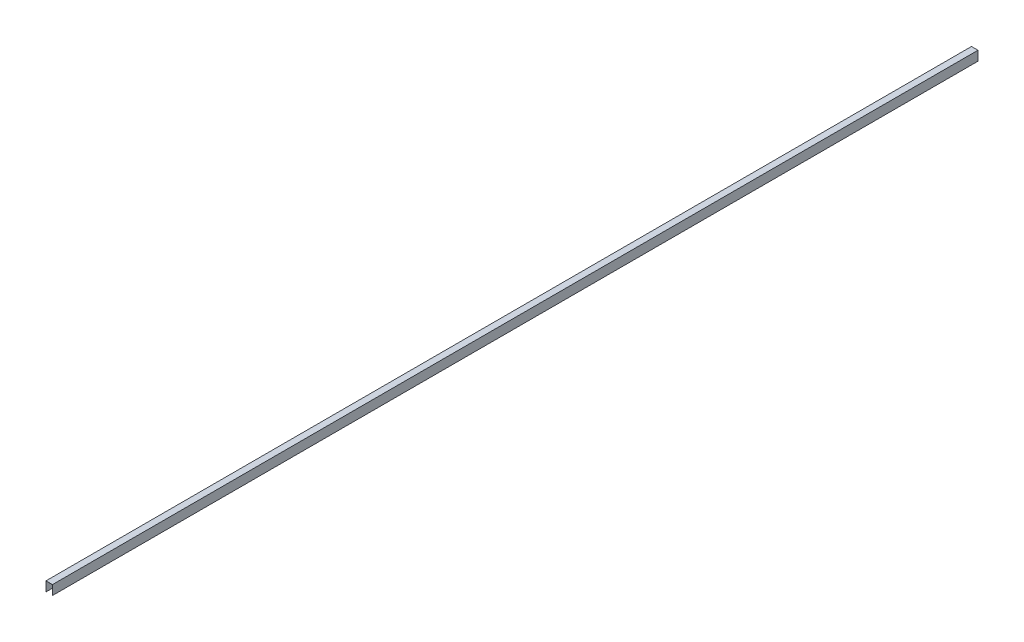
ISO-10303-21;
HEADER;
FILE_DESCRIPTION(('STEP AP214'),'2;1');
FILE_NAME('part.step','',(''),(''),'','','');
FILE_SCHEMA(('AUTOMOTIVE_DESIGN { 1 0 10303 214 1 1 1 1 }'));
ENDSEC;
DATA;
#1=APPLICATION_CONTEXT('core data for automotive mechanical design processes');
#2=APPLICATION_PROTOCOL_DEFINITION('international standard','automotive_design',2000,#1);
#3=PRODUCT_CONTEXT('',#1,'mechanical');
#4=PRODUCT('Part','Part','',(#3));
#5=PRODUCT_RELATED_PRODUCT_CATEGORY('part','',(#4));
#6=PRODUCT_DEFINITION_FORMATION('','',#4);
#7=PRODUCT_DEFINITION_CONTEXT('part definition',#1,'design');
#8=PRODUCT_DEFINITION('design','',#6,#7);
#9=PRODUCT_DEFINITION_SHAPE('','',#8);
#10=(LENGTH_UNIT() NAMED_UNIT(*) SI_UNIT(.MILLI.,.METRE.));
#11=(NAMED_UNIT(*) PLANE_ANGLE_UNIT() SI_UNIT($,.RADIAN.));
#12=(NAMED_UNIT(*) SI_UNIT($,.STERADIAN.) SOLID_ANGLE_UNIT());
#13=UNCERTAINTY_MEASURE_WITH_UNIT(LENGTH_MEASURE(1.E-05),#10,'distance_accuracy_value','');
#14=(GEOMETRIC_REPRESENTATION_CONTEXT(3) GLOBAL_UNCERTAINTY_ASSIGNED_CONTEXT((#13)) GLOBAL_UNIT_ASSIGNED_CONTEXT((#10,
#11,#12)) REPRESENTATION_CONTEXT('',''));
#15=CARTESIAN_POINT('',(0.,0.,0.));
#16=DIRECTION('',(0.,0.,1.));
#17=DIRECTION('',(1.,0.,0.));
#18=AXIS2_PLACEMENT_3D('',#15,#16,#17);
#19=CARTESIAN_POINT('',(0.254000000000004,0.,1879.6));
#20=DIRECTION('',(0.,1.,0.));
#21=DIRECTION('',(0.,0.,1.));
#22=AXIS2_PLACEMENT_3D('',#19,#20,#21);
#23=PLANE('',#22);
#24=DIRECTION('',(1.,0.,0.));
#25=VECTOR('',#24,1.);
#26=CARTESIAN_POINT('',(0.254000000000004,0.,0.));
#27=LINE('',#26,#25);
#28=CARTESIAN_POINT('',(0.,0.,0.));
#29=VERTEX_POINT('',#28);
#30=CARTESIAN_POINT('',(0.254000000000004,0.,0.));
#31=VERTEX_POINT('',#30);
#32=EDGE_CURVE('E126',#29,#31,#27,.T.);
#33=ORIENTED_EDGE('',*,*,#32,.T.);
#34=DIRECTION('',(0.,0.,-1.));
#35=VECTOR('',#34,1.);
#36=CARTESIAN_POINT('',(0.254000000000004,0.,1879.6));
#37=LINE('',#36,#35);
#38=CARTESIAN_POINT('',(0.254000000000004,0.,1879.6));
#39=VERTEX_POINT('',#38);
#40=EDGE_CURVE('E11',#39,#31,#37,.T.);
#41=ORIENTED_EDGE('',*,*,#40,.F.);
#42=DIRECTION('',(1.,0.,0.));
#43=VECTOR('',#42,1.);
#44=CARTESIAN_POINT('',(0.254000000000004,0.,1879.6));
#45=LINE('',#44,#43);
#46=CARTESIAN_POINT('',(0.,0.,1879.6));
#47=VERTEX_POINT('',#46);
#48=EDGE_CURVE('E140',#47,#39,#45,.T.);
#49=ORIENTED_EDGE('',*,*,#48,.F.);
#50=DIRECTION('',(0.,0.,-1.));
#51=VECTOR('',#50,1.);
#52=CARTESIAN_POINT('',(0.,0.,1879.6));
#53=LINE('',#52,#51);
#54=EDGE_CURVE('E122',#47,#29,#53,.T.);
#55=ORIENTED_EDGE('',*,*,#54,.T.);
#56=EDGE_LOOP('',(#33,#41,#49,#55));
#57=FACE_BOUND('',#56,.T.);
#58=ADVANCED_FACE('F30',(#57),#23,.F.);
#59=CARTESIAN_POINT('',(0.254000000000004,19.05,1879.6));
#60=DIRECTION('',(-1.,0.,0.));
#61=DIRECTION('',(0.,-1.,0.));
#62=AXIS2_PLACEMENT_3D('',#59,#60,#61);
#63=PLANE('',#62);
#64=DIRECTION('',(0.,1.,0.));
#65=VECTOR('',#64,1.);
#66=CARTESIAN_POINT('',(0.254000000000004,19.05,0.));
#67=LINE('',#66,#65);
#68=CARTESIAN_POINT('',(0.254000000000004,19.05,0.));
#69=VERTEX_POINT('',#68);
#70=EDGE_CURVE('E129',#31,#69,#67,.T.);
#71=ORIENTED_EDGE('',*,*,#70,.T.);
#72=DIRECTION('',(0.,0.,-1.));
#73=VECTOR('',#72,1.);
#74=CARTESIAN_POINT('',(0.254000000000004,19.05,1879.6));
#75=LINE('',#74,#73);
#76=CARTESIAN_POINT('',(0.254000000000004,19.05,1879.6));
#77=VERTEX_POINT('',#76);
#78=EDGE_CURVE('E38',#77,#69,#75,.T.);
#79=ORIENTED_EDGE('',*,*,#78,.F.);
#80=DIRECTION('',(0.,1.,0.));
#81=VECTOR('',#80,1.);
#82=CARTESIAN_POINT('',(0.254000000000004,19.05,1879.6));
#83=LINE('',#82,#81);
#84=EDGE_CURVE('E89',#39,#77,#83,.T.);
#85=ORIENTED_EDGE('',*,*,#84,.F.);
#86=ORIENTED_EDGE('',*,*,#40,.T.);
#87=EDGE_LOOP('',(#71,#79,#85,#86));
#88=FACE_BOUND('',#87,.T.);
#89=ADVANCED_FACE('F175',(#88),#63,.F.);
#90=CARTESIAN_POINT('',(12.954,19.05,1879.6));
#91=DIRECTION('',(0.,1.,0.));
#92=DIRECTION('',(-1.,0.,0.));
#93=AXIS2_PLACEMENT_3D('',#90,#91,#92);
#94=PLANE('',#93);
#95=DIRECTION('',(1.,0.,0.));
#96=VECTOR('',#95,1.);
#97=CARTESIAN_POINT('',(12.954,19.05,0.));
#98=LINE('',#97,#96);
#99=CARTESIAN_POINT('',(12.954,19.05,0.));
#100=VERTEX_POINT('',#99);
#101=EDGE_CURVE('E131',#69,#100,#98,.T.);
#102=ORIENTED_EDGE('',*,*,#101,.T.);
#103=DIRECTION('',(0.,0.,-1.));
#104=VECTOR('',#103,1.);
#105=CARTESIAN_POINT('',(12.954,19.05,1879.6));
#106=LINE('',#105,#104);
#107=CARTESIAN_POINT('',(12.954,19.05,1879.6));
#108=VERTEX_POINT('',#107);
#109=EDGE_CURVE('E147',#108,#100,#106,.T.);
#110=ORIENTED_EDGE('',*,*,#109,.F.);
#111=DIRECTION('',(1.,0.,0.));
#112=VECTOR('',#111,1.);
#113=CARTESIAN_POINT('',(12.954,19.05,1879.6));
#114=LINE('',#113,#112);
#115=EDGE_CURVE('E155',#77,#108,#114,.T.);
#116=ORIENTED_EDGE('',*,*,#115,.F.);
#117=ORIENTED_EDGE('',*,*,#78,.T.);
#118=EDGE_LOOP('',(#102,#110,#116,#117));
#119=FACE_BOUND('',#118,.T.);
#120=ADVANCED_FACE('F153',(#119),#94,.F.);
#121=CARTESIAN_POINT('',(12.954,0.,1879.6));
#122=DIRECTION('',(1.,0.,0.));
#123=DIRECTION('',(0.,0.,-1.));
#124=AXIS2_PLACEMENT_3D('',#121,#122,#123);
#125=PLANE('',#124);
#126=DIRECTION('',(0.,-1.,0.));
#127=VECTOR('',#126,1.);
#128=CARTESIAN_POINT('',(12.954,0.,0.));
#129=LINE('',#128,#127);
#130=CARTESIAN_POINT('',(12.954,0.,0.));
#131=VERTEX_POINT('',#130);
#132=EDGE_CURVE('E133',#100,#131,#129,.T.);
#133=ORIENTED_EDGE('',*,*,#132,.T.);
#134=DIRECTION('',(0.,0.,-1.));
#135=VECTOR('',#134,1.);
#136=CARTESIAN_POINT('',(12.954,0.,1879.6));
#137=LINE('',#136,#135);
#138=CARTESIAN_POINT('',(12.954,0.,1879.6));
#139=VERTEX_POINT('',#138);
#140=EDGE_CURVE('E144',#139,#131,#137,.T.);
#141=ORIENTED_EDGE('',*,*,#140,.F.);
#142=DIRECTION('',(0.,-1.,0.));
#143=VECTOR('',#142,1.);
#144=CARTESIAN_POINT('',(12.954,0.,1879.6));
#145=LINE('',#144,#143);
#146=EDGE_CURVE('E167',#108,#139,#145,.T.);
#147=ORIENTED_EDGE('',*,*,#146,.F.);
#148=ORIENTED_EDGE('',*,*,#109,.T.);
#149=EDGE_LOOP('',(#133,#141,#147,#148));
#150=FACE_BOUND('',#149,.T.);
#151=ADVANCED_FACE('F163',(#150),#125,.F.);
#152=CARTESIAN_POINT('',(13.208,0.,1879.6));
#153=DIRECTION('',(0.,1.,0.));
#154=DIRECTION('',(-1.,0.,0.));
#155=AXIS2_PLACEMENT_3D('',#152,#153,#154);
#156=PLANE('',#155);
#157=DIRECTION('',(1.,0.,0.));
#158=VECTOR('',#157,1.);
#159=CARTESIAN_POINT('',(13.208,0.,0.));
#160=LINE('',#159,#158);
#161=CARTESIAN_POINT('',(13.208,0.,0.));
#162=VERTEX_POINT('',#161);
#163=EDGE_CURVE('E135',#131,#162,#160,.T.);
#164=ORIENTED_EDGE('',*,*,#163,.T.);
#165=DIRECTION('',(0.,0.,-1.));
#166=VECTOR('',#165,1.);
#167=CARTESIAN_POINT('',(13.208,0.,1879.6));
#168=LINE('',#167,#166);
#169=CARTESIAN_POINT('',(13.208,0.,1879.6));
#170=VERTEX_POINT('',#169);
#171=EDGE_CURVE('E117',#170,#162,#168,.T.);
#172=ORIENTED_EDGE('',*,*,#171,.F.);
#173=DIRECTION('',(1.,0.,0.));
#174=VECTOR('',#173,1.);
#175=CARTESIAN_POINT('',(13.208,0.,1879.6));
#176=LINE('',#175,#174);
#177=EDGE_CURVE('E108',#139,#170,#176,.T.);
#178=ORIENTED_EDGE('',*,*,#177,.F.);
#179=ORIENTED_EDGE('',*,*,#140,.T.);
#180=EDGE_LOOP('',(#164,#172,#178,#179));
#181=FACE_BOUND('',#180,.T.);
#182=ADVANCED_FACE('F166',(#181),#156,.F.);
#183=CARTESIAN_POINT('',(13.208,19.304,1879.6));
#184=DIRECTION('',(-1.,0.,0.));
#185=DIRECTION('',(0.,0.,1.));
#186=AXIS2_PLACEMENT_3D('',#183,#184,#185);
#187=PLANE('',#186);
#188=DIRECTION('',(0.,1.,0.));
#189=VECTOR('',#188,1.);
#190=CARTESIAN_POINT('',(13.208,19.304,0.));
#191=LINE('',#190,#189);
#192=CARTESIAN_POINT('',(13.208,19.304,0.));
#193=VERTEX_POINT('',#192);
#194=EDGE_CURVE('E116',#162,#193,#191,.T.);
#195=ORIENTED_EDGE('',*,*,#194,.T.);
#196=DIRECTION('',(0.,0.,-1.));
#197=VECTOR('',#196,1.);
#198=CARTESIAN_POINT('',(13.208,19.304,1879.6));
#199=LINE('',#198,#197);
#200=CARTESIAN_POINT('',(13.208,19.304,1879.6));
#201=VERTEX_POINT('',#200);
#202=EDGE_CURVE('E113',#201,#193,#199,.T.);
#203=ORIENTED_EDGE('',*,*,#202,.F.);
#204=DIRECTION('',(0.,1.,0.));
#205=VECTOR('',#204,1.);
#206=CARTESIAN_POINT('',(13.208,19.304,1879.6));
#207=LINE('',#206,#205);
#208=EDGE_CURVE('E102',#170,#201,#207,.T.);
#209=ORIENTED_EDGE('',*,*,#208,.F.);
#210=ORIENTED_EDGE('',*,*,#171,.T.);
#211=EDGE_LOOP('',(#195,#203,#209,#210));
#212=FACE_BOUND('',#211,.T.);
#213=ADVANCED_FACE('F114',(#212),#187,.F.);
#214=CARTESIAN_POINT('',(0.,19.304,1879.6));
#215=DIRECTION('',(0.,-1.,0.));
#216=DIRECTION('',(0.,0.,-1.));
#217=AXIS2_PLACEMENT_3D('',#214,#215,#216);
#218=PLANE('',#217);
#219=DIRECTION('',(-1.,0.,0.));
#220=VECTOR('',#219,1.);
#221=CARTESIAN_POINT('',(0.,19.304,0.));
#222=LINE('',#221,#220);
#223=CARTESIAN_POINT('',(0.,19.304,0.));
#224=VERTEX_POINT('',#223);
#225=EDGE_CURVE('E75',#193,#224,#222,.T.);
#226=ORIENTED_EDGE('',*,*,#225,.T.);
#227=DIRECTION('',(0.,0.,-1.));
#228=VECTOR('',#227,1.);
#229=CARTESIAN_POINT('',(0.,19.304,1879.6));
#230=LINE('',#229,#228);
#231=CARTESIAN_POINT('',(0.,19.304,1879.6));
#232=VERTEX_POINT('',#231);
#233=EDGE_CURVE('E118',#232,#224,#230,.T.);
#234=ORIENTED_EDGE('',*,*,#233,.F.);
#235=DIRECTION('',(-1.,0.,0.));
#236=VECTOR('',#235,1.);
#237=CARTESIAN_POINT('',(0.,19.304,1879.6));
#238=LINE('',#237,#236);
#239=EDGE_CURVE('E106',#201,#232,#238,.T.);
#240=ORIENTED_EDGE('',*,*,#239,.F.);
#241=ORIENTED_EDGE('',*,*,#202,.T.);
#242=EDGE_LOOP('',(#226,#234,#240,#241));
#243=FACE_BOUND('',#242,.T.);
#244=ADVANCED_FACE('F120',(#243),#218,.F.);
#245=CARTESIAN_POINT('',(0.,0.,1879.6));
#246=DIRECTION('',(1.,0.,0.));
#247=DIRECTION('',(0.,0.,-1.));
#248=AXIS2_PLACEMENT_3D('',#245,#246,#247);
#249=PLANE('',#248);
#250=DIRECTION('',(0.,-1.,0.));
#251=VECTOR('',#250,1.);
#252=CARTESIAN_POINT('',(0.,0.,0.));
#253=LINE('',#252,#251);
#254=EDGE_CURVE('E81',#224,#29,#253,.T.);
#255=ORIENTED_EDGE('',*,*,#254,.T.);
#256=ORIENTED_EDGE('',*,*,#54,.F.);
#257=DIRECTION('',(0.,-1.,0.));
#258=VECTOR('',#257,1.);
#259=CARTESIAN_POINT('',(0.,0.,1879.6));
#260=LINE('',#259,#258);
#261=EDGE_CURVE('E46',#232,#47,#260,.T.);
#262=ORIENTED_EDGE('',*,*,#261,.F.);
#263=ORIENTED_EDGE('',*,*,#233,.T.);
#264=EDGE_LOOP('',(#255,#256,#262,#263));
#265=FACE_BOUND('',#264,.T.);
#266=ADVANCED_FACE('F191',(#265),#249,.F.);
#267=CARTESIAN_POINT('',(0.,0.,1879.6));
#268=DIRECTION('',(0.,0.,-1.));
#269=DIRECTION('',(-1.,0.,0.));
#270=AXIS2_PLACEMENT_3D('',#267,#268,#269);
#271=PLANE('',#270);
#272=ORIENTED_EDGE('',*,*,#48,.T.);
#273=ORIENTED_EDGE('',*,*,#84,.T.);
#274=ORIENTED_EDGE('',*,*,#115,.T.);
#275=ORIENTED_EDGE('',*,*,#146,.T.);
#276=ORIENTED_EDGE('',*,*,#177,.T.);
#277=ORIENTED_EDGE('',*,*,#208,.T.);
#278=ORIENTED_EDGE('',*,*,#239,.T.);
#279=ORIENTED_EDGE('',*,*,#261,.T.);
#280=EDGE_LOOP('',(#272,#273,#274,#275,#276,#277,#278,#279));
#281=FACE_BOUND('',#280,.T.);
#282=ADVANCED_FACE('F104',(#281),#271,.F.);
#283=CARTESIAN_POINT('',(0.,0.,0.));
#284=DIRECTION('',(0.,0.,-1.));
#285=DIRECTION('',(-1.,0.,0.));
#286=AXIS2_PLACEMENT_3D('',#283,#284,#285);
#287=PLANE('',#286);
#288=ORIENTED_EDGE('',*,*,#32,.F.);
#289=ORIENTED_EDGE('',*,*,#254,.F.);
#290=ORIENTED_EDGE('',*,*,#225,.F.);
#291=ORIENTED_EDGE('',*,*,#194,.F.);
#292=ORIENTED_EDGE('',*,*,#163,.F.);
#293=ORIENTED_EDGE('',*,*,#132,.F.);
#294=ORIENTED_EDGE('',*,*,#101,.F.);
#295=ORIENTED_EDGE('',*,*,#70,.F.);
#296=EDGE_LOOP('',(#288,#289,#290,#291,#292,#293,#294,#295));
#297=FACE_BOUND('',#296,.T.);
#298=ADVANCED_FACE('F159',(#297),#287,.T.);
#299=CLOSED_SHELL('',(#58,#89,#120,#151,#182,#213,#244,#266,#282,#298));
#300=MANIFOLD_SOLID_BREP('B2',#299);
#301=ADVANCED_BREP_SHAPE_REPRESENTATION('',(#18,#300),#14);
#302=SHAPE_DEFINITION_REPRESENTATION(#9,#301);
ENDSEC;
END-ISO-10303-21;
